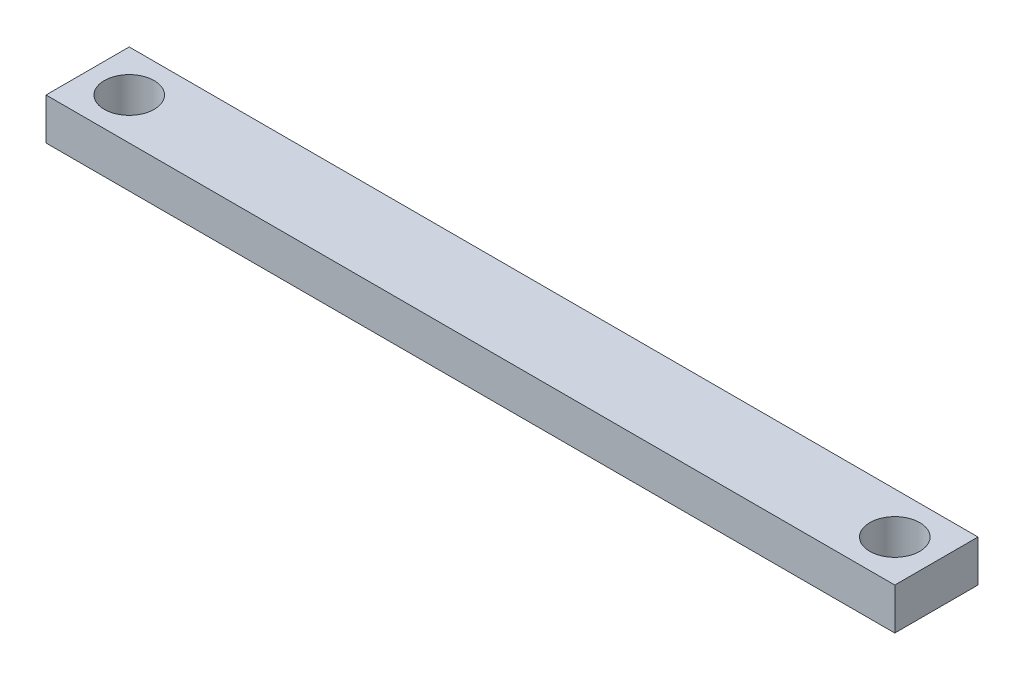
ISO-10303-21;
HEADER;
FILE_DESCRIPTION(('STEP AP214'),'2;1');
FILE_NAME('part.step','',(''),(''),'','','');
FILE_SCHEMA(('AUTOMOTIVE_DESIGN { 1 0 10303 214 1 1 1 1 }'));
ENDSEC;
DATA;
#1=APPLICATION_CONTEXT('core data for automotive mechanical design processes');
#2=APPLICATION_PROTOCOL_DEFINITION('international standard','automotive_design',2000,#1);
#3=PRODUCT_CONTEXT('',#1,'mechanical');
#4=PRODUCT('Part','Part','',(#3));
#5=PRODUCT_RELATED_PRODUCT_CATEGORY('part','',(#4));
#6=PRODUCT_DEFINITION_FORMATION('','',#4);
#7=PRODUCT_DEFINITION_CONTEXT('part definition',#1,'design');
#8=PRODUCT_DEFINITION('design','',#6,#7);
#9=PRODUCT_DEFINITION_SHAPE('','',#8);
#10=(LENGTH_UNIT() NAMED_UNIT(*) SI_UNIT(.MILLI.,.METRE.));
#11=(NAMED_UNIT(*) PLANE_ANGLE_UNIT() SI_UNIT($,.RADIAN.));
#12=(NAMED_UNIT(*) SI_UNIT($,.STERADIAN.) SOLID_ANGLE_UNIT());
#13=UNCERTAINTY_MEASURE_WITH_UNIT(LENGTH_MEASURE(1.E-05),#10,'distance_accuracy_value','');
#14=(GEOMETRIC_REPRESENTATION_CONTEXT(3) GLOBAL_UNCERTAINTY_ASSIGNED_CONTEXT((#13)) GLOBAL_UNIT_ASSIGNED_CONTEXT((#10,
#11,#12)) REPRESENTATION_CONTEXT('',''));
#15=CARTESIAN_POINT('',(0.,0.,0.));
#16=DIRECTION('',(0.,0.,1.));
#17=DIRECTION('',(1.,0.,0.));
#18=AXIS2_PLACEMENT_3D('',#15,#16,#17);
#19=CARTESIAN_POINT('',(0.,2.5,0.));
#20=DIRECTION('',(0.,-1.,0.));
#21=DIRECTION('',(0.,0.,-1.));
#22=AXIS2_PLACEMENT_3D('',#19,#20,#21);
#23=PLANE('',#22);
#24=DIRECTION('',(0.,0.,1.));
#25=VECTOR('',#24,1.);
#26=CARTESIAN_POINT('',(-51.,2.5,-4.99999999999999));
#27=LINE('',#26,#25);
#28=CARTESIAN_POINT('',(-51.,2.5,-4.99999999999999));
#29=VERTEX_POINT('',#28);
#30=CARTESIAN_POINT('',(-51.,2.5,5.00000000000001));
#31=VERTEX_POINT('',#30);
#32=EDGE_CURVE('E85',#29,#31,#27,.T.);
#33=ORIENTED_EDGE('',*,*,#32,.T.);
#34=DIRECTION('',(1.,0.,0.));
#35=VECTOR('',#34,1.);
#36=CARTESIAN_POINT('',(51.,2.5,5.));
#37=LINE('',#36,#35);
#38=CARTESIAN_POINT('',(51.,2.5,5.));
#39=VERTEX_POINT('',#38);
#40=EDGE_CURVE('E80',#31,#39,#37,.T.);
#41=ORIENTED_EDGE('',*,*,#40,.T.);
#42=DIRECTION('',(0.,0.,-1.));
#43=VECTOR('',#42,1.);
#44=CARTESIAN_POINT('',(51.,2.5,-5.));
#45=LINE('',#44,#43);
#46=CARTESIAN_POINT('',(51.,2.5,-5.));
#47=VERTEX_POINT('',#46);
#48=EDGE_CURVE('E83',#39,#47,#45,.T.);
#49=ORIENTED_EDGE('',*,*,#48,.T.);
#50=DIRECTION('',(-1.,0.,0.));
#51=VECTOR('',#50,1.);
#52=CARTESIAN_POINT('',(51.,2.5,-5.));
#53=LINE('',#52,#51);
#54=EDGE_CURVE('E50',#47,#29,#53,.T.);
#55=ORIENTED_EDGE('',*,*,#54,.T.);
#56=EDGE_LOOP('',(#33,#41,#49,#55));
#57=FACE_BOUND('',#56,.T.);
#58=CARTESIAN_POINT('',(-46.,2.5,0.));
#59=DIRECTION('',(0.,1.,0.));
#60=DIRECTION('',(0.,0.,1.));
#61=AXIS2_PLACEMENT_3D('',#58,#59,#60);
#62=CIRCLE('',#61,2.99999999999999);
#63=CARTESIAN_POINT('',(-46.,2.5,3.));
#64=VERTEX_POINT('',#63);
#65=EDGE_CURVE('E100',#64,#64,#62,.T.);
#66=ORIENTED_EDGE('',*,*,#65,.F.);
#67=EDGE_LOOP('',(#66));
#68=FACE_BOUND('',#67,.T.);
#69=CARTESIAN_POINT('',(46.,2.5,0.));
#70=DIRECTION('',(0.,1.,0.));
#71=DIRECTION('',(0.,0.,1.));
#72=AXIS2_PLACEMENT_3D('',#69,#70,#71);
#73=CIRCLE('',#72,2.99999999999999);
#74=CARTESIAN_POINT('',(46.,2.5,2.99999999999999));
#75=VERTEX_POINT('',#74);
#76=EDGE_CURVE('E115',#75,#75,#73,.T.);
#77=ORIENTED_EDGE('',*,*,#76,.F.);
#78=EDGE_LOOP('',(#77));
#79=FACE_BOUND('',#78,.T.);
#80=ADVANCED_FACE('F33',(#57,#68,#79),#23,.F.);
#81=CARTESIAN_POINT('',(0.,-2.5,0.));
#82=DIRECTION('',(0.,-1.,0.));
#83=DIRECTION('',(0.,0.,-1.));
#84=AXIS2_PLACEMENT_3D('',#81,#82,#83);
#85=PLANE('',#84);
#86=CARTESIAN_POINT('',(-46.,-2.5,0.));
#87=DIRECTION('',(0.,1.,0.));
#88=DIRECTION('',(0.,0.,1.));
#89=AXIS2_PLACEMENT_3D('',#86,#87,#88);
#90=CIRCLE('',#89,2.99999999999999);
#91=CARTESIAN_POINT('',(-46.,-2.5,3.));
#92=VERTEX_POINT('',#91);
#93=EDGE_CURVE('E112',#92,#92,#90,.T.);
#94=ORIENTED_EDGE('',*,*,#93,.T.);
#95=EDGE_LOOP('',(#94));
#96=FACE_BOUND('',#95,.T.);
#97=DIRECTION('',(0.,0.,1.));
#98=VECTOR('',#97,1.);
#99=CARTESIAN_POINT('',(-51.,-2.5,-4.99999999999999));
#100=LINE('',#99,#98);
#101=CARTESIAN_POINT('',(-51.,-2.5,-4.99999999999999));
#102=VERTEX_POINT('',#101);
#103=CARTESIAN_POINT('',(-51.,-2.5,5.00000000000001));
#104=VERTEX_POINT('',#103);
#105=EDGE_CURVE('E97',#102,#104,#100,.T.);
#106=ORIENTED_EDGE('',*,*,#105,.F.);
#107=DIRECTION('',(-1.,0.,0.));
#108=VECTOR('',#107,1.);
#109=CARTESIAN_POINT('',(51.,-2.5,-5.));
#110=LINE('',#109,#108);
#111=CARTESIAN_POINT('',(51.,-2.5,-5.));
#112=VERTEX_POINT('',#111);
#113=EDGE_CURVE('E73',#112,#102,#110,.T.);
#114=ORIENTED_EDGE('',*,*,#113,.F.);
#115=DIRECTION('',(0.,0.,-1.));
#116=VECTOR('',#115,1.);
#117=CARTESIAN_POINT('',(51.,-2.5,-5.));
#118=LINE('',#117,#116);
#119=CARTESIAN_POINT('',(51.,-2.5,5.));
#120=VERTEX_POINT('',#119);
#121=EDGE_CURVE('E67',#120,#112,#118,.T.);
#122=ORIENTED_EDGE('',*,*,#121,.F.);
#123=DIRECTION('',(1.,0.,0.));
#124=VECTOR('',#123,1.);
#125=CARTESIAN_POINT('',(51.,-2.5,5.));
#126=LINE('',#125,#124);
#127=EDGE_CURVE('E89',#104,#120,#126,.T.);
#128=ORIENTED_EDGE('',*,*,#127,.F.);
#129=EDGE_LOOP('',(#106,#114,#122,#128));
#130=FACE_BOUND('',#129,.T.);
#131=CARTESIAN_POINT('',(46.,-2.5,0.));
#132=DIRECTION('',(0.,1.,0.));
#133=DIRECTION('',(0.,0.,1.));
#134=AXIS2_PLACEMENT_3D('',#131,#132,#133);
#135=CIRCLE('',#134,2.99999999999999);
#136=CARTESIAN_POINT('',(46.,-2.5,2.99999999999999));
#137=VERTEX_POINT('',#136);
#138=EDGE_CURVE('E118',#137,#137,#135,.T.);
#139=ORIENTED_EDGE('',*,*,#138,.T.);
#140=EDGE_LOOP('',(#139));
#141=FACE_BOUND('',#140,.T.);
#142=ADVANCED_FACE('F108',(#96,#130,#141),#85,.T.);
#143=CARTESIAN_POINT('',(-51.,2.5,-4.99999999999999));
#144=DIRECTION('',(1.,0.,0.));
#145=DIRECTION('',(0.,0.,-1.));
#146=AXIS2_PLACEMENT_3D('',#143,#144,#145);
#147=PLANE('',#146);
#148=ORIENTED_EDGE('',*,*,#105,.T.);
#149=DIRECTION('',(0.,-1.,0.));
#150=VECTOR('',#149,1.);
#151=CARTESIAN_POINT('',(-51.,2.5,5.00000000000001));
#152=LINE('',#151,#150);
#153=EDGE_CURVE('E11',#31,#104,#152,.T.);
#154=ORIENTED_EDGE('',*,*,#153,.F.);
#155=ORIENTED_EDGE('',*,*,#32,.F.);
#156=DIRECTION('',(0.,-1.,0.));
#157=VECTOR('',#156,1.);
#158=CARTESIAN_POINT('',(-51.,2.5,-4.99999999999999));
#159=LINE('',#158,#157);
#160=EDGE_CURVE('E93',#29,#102,#159,.T.);
#161=ORIENTED_EDGE('',*,*,#160,.T.);
#162=EDGE_LOOP('',(#148,#154,#155,#161));
#163=FACE_BOUND('',#162,.T.);
#164=ADVANCED_FACE('F35',(#163),#147,.F.);
#165=CARTESIAN_POINT('',(51.,2.5,5.));
#166=DIRECTION('',(0.,0.,-1.));
#167=DIRECTION('',(-1.,0.,0.));
#168=AXIS2_PLACEMENT_3D('',#165,#166,#167);
#169=PLANE('',#168);
#170=ORIENTED_EDGE('',*,*,#127,.T.);
#171=DIRECTION('',(0.,-1.,0.));
#172=VECTOR('',#171,1.);
#173=CARTESIAN_POINT('',(51.,2.5,5.));
#174=LINE('',#173,#172);
#175=EDGE_CURVE('E42',#39,#120,#174,.T.);
#176=ORIENTED_EDGE('',*,*,#175,.F.);
#177=ORIENTED_EDGE('',*,*,#40,.F.);
#178=ORIENTED_EDGE('',*,*,#153,.T.);
#179=EDGE_LOOP('',(#170,#176,#177,#178));
#180=FACE_BOUND('',#179,.T.);
#181=ADVANCED_FACE('F88',(#180),#169,.F.);
#182=CARTESIAN_POINT('',(51.,2.5,-5.));
#183=DIRECTION('',(-1.,0.,0.));
#184=DIRECTION('',(0.,0.,1.));
#185=AXIS2_PLACEMENT_3D('',#182,#183,#184);
#186=PLANE('',#185);
#187=ORIENTED_EDGE('',*,*,#121,.T.);
#188=DIRECTION('',(0.,-1.,0.));
#189=VECTOR('',#188,1.);
#190=CARTESIAN_POINT('',(51.,2.5,-5.));
#191=LINE('',#190,#189);
#192=EDGE_CURVE('E90',#47,#112,#191,.T.);
#193=ORIENTED_EDGE('',*,*,#192,.F.);
#194=ORIENTED_EDGE('',*,*,#48,.F.);
#195=ORIENTED_EDGE('',*,*,#175,.T.);
#196=EDGE_LOOP('',(#187,#193,#194,#195));
#197=FACE_BOUND('',#196,.T.);
#198=ADVANCED_FACE('F91',(#197),#186,.F.);
#199=CARTESIAN_POINT('',(51.,2.5,-5.));
#200=DIRECTION('',(0.,0.,1.));
#201=DIRECTION('',(1.,0.,0.));
#202=AXIS2_PLACEMENT_3D('',#199,#200,#201);
#203=PLANE('',#202);
#204=ORIENTED_EDGE('',*,*,#113,.T.);
#205=ORIENTED_EDGE('',*,*,#160,.F.);
#206=ORIENTED_EDGE('',*,*,#54,.F.);
#207=ORIENTED_EDGE('',*,*,#192,.T.);
#208=EDGE_LOOP('',(#204,#205,#206,#207));
#209=FACE_BOUND('',#208,.T.);
#210=ADVANCED_FACE('F105',(#209),#203,.F.);
#211=CARTESIAN_POINT('',(-46.,2.5,0.));
#212=DIRECTION('',(0.,-1.,0.));
#213=DIRECTION('',(0.,0.,-1.));
#214=AXIS2_PLACEMENT_3D('',#211,#212,#213);
#215=CYLINDRICAL_SURFACE('',#214,2.99999999999999);
#216=ORIENTED_EDGE('',*,*,#65,.T.);
#217=EDGE_LOOP('',(#216));
#218=FACE_BOUND('',#217,.T.);
#219=ORIENTED_EDGE('',*,*,#93,.F.);
#220=EDGE_LOOP('',(#219));
#221=FACE_BOUND('',#220,.T.);
#222=ADVANCED_FACE('F135',(#218,#221),#215,.F.);
#223=CARTESIAN_POINT('',(46.,2.5,0.));
#224=DIRECTION('',(0.,-1.,0.));
#225=DIRECTION('',(0.,0.,-1.));
#226=AXIS2_PLACEMENT_3D('',#223,#224,#225);
#227=CYLINDRICAL_SURFACE('',#226,2.99999999999999);
#228=ORIENTED_EDGE('',*,*,#76,.T.);
#229=EDGE_LOOP('',(#228));
#230=FACE_BOUND('',#229,.T.);
#231=ORIENTED_EDGE('',*,*,#138,.F.);
#232=EDGE_LOOP('',(#231));
#233=FACE_BOUND('',#232,.T.);
#234=ADVANCED_FACE('F124',(#230,#233),#227,.F.);
#235=CLOSED_SHELL('',(#80,#142,#164,#181,#198,#210,#222,#234));
#236=MANIFOLD_SOLID_BREP('B2',#235);
#237=ADVANCED_BREP_SHAPE_REPRESENTATION('',(#18,#236),#14);
#238=SHAPE_DEFINITION_REPRESENTATION(#9,#237);
ENDSEC;
END-ISO-10303-21;
